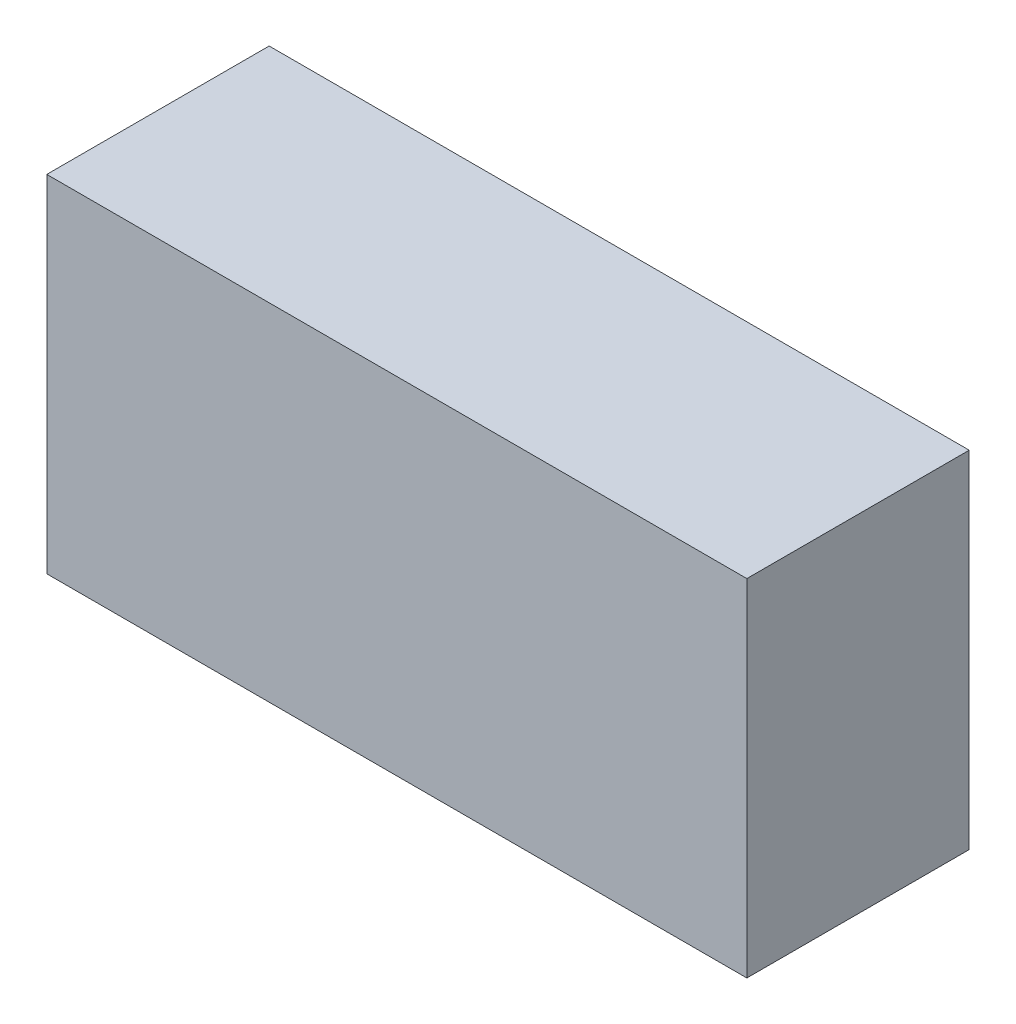
ISO-10303-21;
HEADER;
FILE_DESCRIPTION(('STEP AP214'),'2;1');
FILE_NAME('part.step','',(''),(''),'','','');
FILE_SCHEMA(('AUTOMOTIVE_DESIGN { 1 0 10303 214 1 1 1 1 }'));
ENDSEC;
DATA;
#1=APPLICATION_CONTEXT('core data for automotive mechanical design processes');
#2=APPLICATION_PROTOCOL_DEFINITION('international standard','automotive_design',2000,#1);
#3=PRODUCT_CONTEXT('',#1,'mechanical');
#4=PRODUCT('Part','Part','',(#3));
#5=PRODUCT_RELATED_PRODUCT_CATEGORY('part','',(#4));
#6=PRODUCT_DEFINITION_FORMATION('','',#4);
#7=PRODUCT_DEFINITION_CONTEXT('part definition',#1,'design');
#8=PRODUCT_DEFINITION('design','',#6,#7);
#9=PRODUCT_DEFINITION_SHAPE('','',#8);
#10=(LENGTH_UNIT() NAMED_UNIT(*) SI_UNIT(.MILLI.,.METRE.));
#11=(NAMED_UNIT(*) PLANE_ANGLE_UNIT() SI_UNIT($,.RADIAN.));
#12=(NAMED_UNIT(*) SI_UNIT($,.STERADIAN.) SOLID_ANGLE_UNIT());
#13=UNCERTAINTY_MEASURE_WITH_UNIT(LENGTH_MEASURE(1.E-05),#10,'distance_accuracy_value','');
#14=(GEOMETRIC_REPRESENTATION_CONTEXT(3) GLOBAL_UNCERTAINTY_ASSIGNED_CONTEXT((#13)) GLOBAL_UNIT_ASSIGNED_CONTEXT((#10,
#11,#12)) REPRESENTATION_CONTEXT('',''));
#15=CARTESIAN_POINT('',(0.,0.,0.));
#16=DIRECTION('',(0.,0.,1.));
#17=DIRECTION('',(1.,0.,0.));
#18=AXIS2_PLACEMENT_3D('',#15,#16,#17);
#19=CARTESIAN_POINT('',(0.,0.,27.));
#20=DIRECTION('',(1.,0.,0.));
#21=DIRECTION('',(0.,1.,0.));
#22=AXIS2_PLACEMENT_3D('',#19,#20,#21);
#23=PLANE('',#22);
#24=DIRECTION('',(0.,-1.,0.));
#25=VECTOR('',#24,1.);
#26=CARTESIAN_POINT('',(0.,0.,0.));
#27=LINE('',#26,#25);
#28=CARTESIAN_POINT('',(0.,0.,0.));
#29=VERTEX_POINT('',#28);
#30=CARTESIAN_POINT('',(0.,-42.,0.));
#31=VERTEX_POINT('',#30);
#32=EDGE_CURVE('E107',#29,#31,#27,.T.);
#33=ORIENTED_EDGE('',*,*,#32,.T.);
#34=DIRECTION('',(0.,0.,-1.));
#35=VECTOR('',#34,1.);
#36=CARTESIAN_POINT('',(0.,-42.,27.));
#37=LINE('',#36,#35);
#38=CARTESIAN_POINT('',(0.,-42.,27.));
#39=VERTEX_POINT('',#38);
#40=EDGE_CURVE('E11',#39,#31,#37,.T.);
#41=ORIENTED_EDGE('',*,*,#40,.F.);
#42=DIRECTION('',(0.,-1.,0.));
#43=VECTOR('',#42,1.);
#44=CARTESIAN_POINT('',(0.,0.,27.));
#45=LINE('',#44,#43);
#46=CARTESIAN_POINT('',(0.,0.,27.));
#47=VERTEX_POINT('',#46);
#48=EDGE_CURVE('E91',#47,#39,#45,.T.);
#49=ORIENTED_EDGE('',*,*,#48,.F.);
#50=DIRECTION('',(0.,0.,-1.));
#51=VECTOR('',#50,1.);
#52=CARTESIAN_POINT('',(0.,0.,27.));
#53=LINE('',#52,#51);
#54=EDGE_CURVE('E103',#47,#29,#53,.T.);
#55=ORIENTED_EDGE('',*,*,#54,.T.);
#56=EDGE_LOOP('',(#33,#41,#49,#55));
#57=FACE_BOUND('',#56,.T.);
#58=ADVANCED_FACE('F39',(#57),#23,.F.);
#59=CARTESIAN_POINT('',(0.,-42.,27.));
#60=DIRECTION('',(0.,1.,0.));
#61=DIRECTION('',(0.,0.,1.));
#62=AXIS2_PLACEMENT_3D('',#59,#60,#61);
#63=PLANE('',#62);
#64=DIRECTION('',(1.,0.,0.));
#65=VECTOR('',#64,1.);
#66=CARTESIAN_POINT('',(0.,-42.,0.));
#67=LINE('',#66,#65);
#68=CARTESIAN_POINT('',(85.,-42.,0.));
#69=VERTEX_POINT('',#68);
#70=EDGE_CURVE('E96',#31,#69,#67,.T.);
#71=ORIENTED_EDGE('',*,*,#70,.T.);
#72=DIRECTION('',(0.,0.,-1.));
#73=VECTOR('',#72,1.);
#74=CARTESIAN_POINT('',(85.,-42.,27.));
#75=LINE('',#74,#73);
#76=CARTESIAN_POINT('',(85.,-42.,27.));
#77=VERTEX_POINT('',#76);
#78=EDGE_CURVE('E48',#77,#69,#75,.T.);
#79=ORIENTED_EDGE('',*,*,#78,.F.);
#80=DIRECTION('',(1.,0.,0.));
#81=VECTOR('',#80,1.);
#82=CARTESIAN_POINT('',(0.,-42.,27.));
#83=LINE('',#82,#81);
#84=EDGE_CURVE('E86',#39,#77,#83,.T.);
#85=ORIENTED_EDGE('',*,*,#84,.F.);
#86=ORIENTED_EDGE('',*,*,#40,.T.);
#87=EDGE_LOOP('',(#71,#79,#85,#86));
#88=FACE_BOUND('',#87,.T.);
#89=ADVANCED_FACE('F95',(#88),#63,.F.);
#90=CARTESIAN_POINT('',(85.,0.,27.));
#91=DIRECTION('',(-1.,0.,0.));
#92=DIRECTION('',(0.,0.,1.));
#93=AXIS2_PLACEMENT_3D('',#90,#91,#92);
#94=PLANE('',#93);
#95=DIRECTION('',(0.,1.,0.));
#96=VECTOR('',#95,1.);
#97=CARTESIAN_POINT('',(85.,0.,0.));
#98=LINE('',#97,#96);
#99=CARTESIAN_POINT('',(85.,0.,0.));
#100=VERTEX_POINT('',#99);
#101=EDGE_CURVE('E73',#69,#100,#98,.T.);
#102=ORIENTED_EDGE('',*,*,#101,.T.);
#103=DIRECTION('',(0.,0.,-1.));
#104=VECTOR('',#103,1.);
#105=CARTESIAN_POINT('',(85.,0.,27.));
#106=LINE('',#105,#104);
#107=CARTESIAN_POINT('',(85.,0.,27.));
#108=VERTEX_POINT('',#107);
#109=EDGE_CURVE('E98',#108,#100,#106,.T.);
#110=ORIENTED_EDGE('',*,*,#109,.F.);
#111=DIRECTION('',(0.,1.,0.));
#112=VECTOR('',#111,1.);
#113=CARTESIAN_POINT('',(85.,0.,27.));
#114=LINE('',#113,#112);
#115=EDGE_CURVE('E89',#77,#108,#114,.T.);
#116=ORIENTED_EDGE('',*,*,#115,.F.);
#117=ORIENTED_EDGE('',*,*,#78,.T.);
#118=EDGE_LOOP('',(#102,#110,#116,#117));
#119=FACE_BOUND('',#118,.T.);
#120=ADVANCED_FACE('F99',(#119),#94,.F.);
#121=CARTESIAN_POINT('',(0.,0.,27.));
#122=DIRECTION('',(0.,-1.,0.));
#123=DIRECTION('',(0.,0.,-1.));
#124=AXIS2_PLACEMENT_3D('',#121,#122,#123);
#125=PLANE('',#124);
#126=DIRECTION('',(-1.,0.,0.));
#127=VECTOR('',#126,1.);
#128=CARTESIAN_POINT('',(0.,0.,0.));
#129=LINE('',#128,#127);
#130=EDGE_CURVE('E79',#100,#29,#129,.T.);
#131=ORIENTED_EDGE('',*,*,#130,.T.);
#132=ORIENTED_EDGE('',*,*,#54,.F.);
#133=DIRECTION('',(-1.,0.,0.));
#134=VECTOR('',#133,1.);
#135=CARTESIAN_POINT('',(0.,0.,27.));
#136=LINE('',#135,#134);
#137=EDGE_CURVE('E56',#108,#47,#136,.T.);
#138=ORIENTED_EDGE('',*,*,#137,.F.);
#139=ORIENTED_EDGE('',*,*,#109,.T.);
#140=EDGE_LOOP('',(#131,#132,#138,#139));
#141=FACE_BOUND('',#140,.T.);
#142=ADVANCED_FACE('F120',(#141),#125,.F.);
#143=CARTESIAN_POINT('',(0.,0.,27.));
#144=DIRECTION('',(0.,0.,1.));
#145=DIRECTION('',(1.,0.,0.));
#146=AXIS2_PLACEMENT_3D('',#143,#144,#145);
#147=PLANE('',#146);
#148=ORIENTED_EDGE('',*,*,#48,.T.);
#149=ORIENTED_EDGE('',*,*,#84,.T.);
#150=ORIENTED_EDGE('',*,*,#115,.T.);
#151=ORIENTED_EDGE('',*,*,#137,.T.);
#152=EDGE_LOOP('',(#148,#149,#150,#151));
#153=FACE_BOUND('',#152,.T.);
#154=ADVANCED_FACE('F87',(#153),#147,.T.);
#155=CARTESIAN_POINT('',(0.,0.,0.));
#156=DIRECTION('',(0.,0.,1.));
#157=DIRECTION('',(1.,0.,0.));
#158=AXIS2_PLACEMENT_3D('',#155,#156,#157);
#159=PLANE('',#158);
#160=ORIENTED_EDGE('',*,*,#32,.F.);
#161=ORIENTED_EDGE('',*,*,#130,.F.);
#162=ORIENTED_EDGE('',*,*,#101,.F.);
#163=ORIENTED_EDGE('',*,*,#70,.F.);
#164=EDGE_LOOP('',(#160,#161,#162,#163));
#165=FACE_BOUND('',#164,.T.);
#166=ADVANCED_FACE('F123',(#165),#159,.F.);
#167=CLOSED_SHELL('',(#58,#89,#120,#142,#154,#166));
#168=MANIFOLD_SOLID_BREP('B2',#167);
#169=ADVANCED_BREP_SHAPE_REPRESENTATION('',(#18,#168),#14);
#170=SHAPE_DEFINITION_REPRESENTATION(#9,#169);
ENDSEC;
END-ISO-10303-21;
